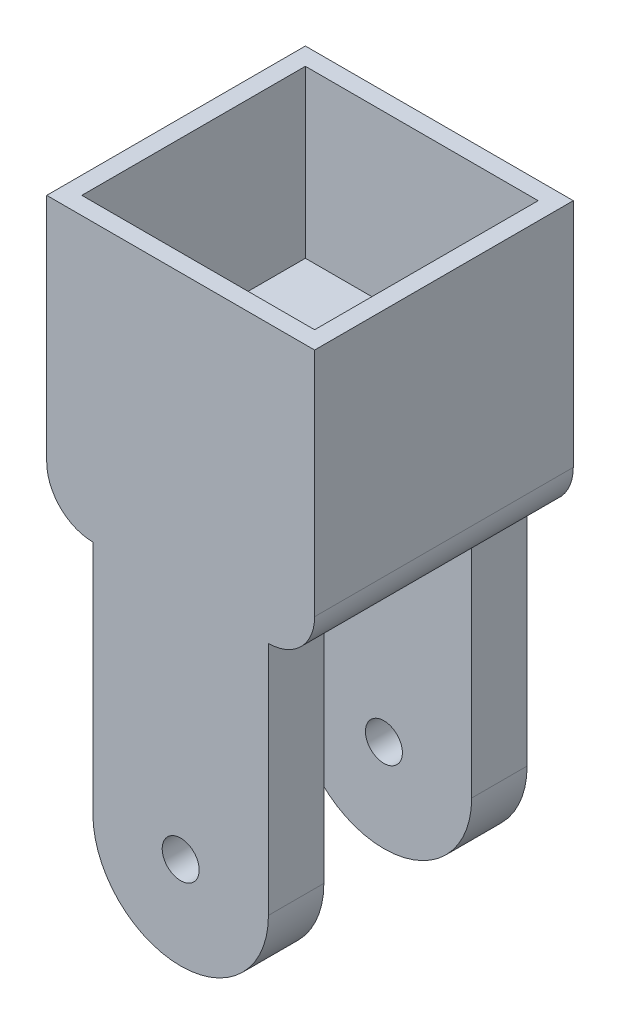
ISO-10303-21;
HEADER;
FILE_DESCRIPTION(('STEP AP214'),'2;1');
FILE_NAME('part.step','',(''),(''),'','','');
FILE_SCHEMA(('AUTOMOTIVE_DESIGN { 1 0 10303 214 1 1 1 1 }'));
ENDSEC;
DATA;
#1=APPLICATION_CONTEXT('core data for automotive mechanical design processes');
#2=APPLICATION_PROTOCOL_DEFINITION('international standard','automotive_design',2000,#1);
#3=PRODUCT_CONTEXT('',#1,'mechanical');
#4=PRODUCT('Part','Part','',(#3));
#5=PRODUCT_RELATED_PRODUCT_CATEGORY('part','',(#4));
#6=PRODUCT_DEFINITION_FORMATION('','',#4);
#7=PRODUCT_DEFINITION_CONTEXT('part definition',#1,'design');
#8=PRODUCT_DEFINITION('design','',#6,#7);
#9=PRODUCT_DEFINITION_SHAPE('','',#8);
#10=(LENGTH_UNIT() NAMED_UNIT(*) SI_UNIT(.MILLI.,.METRE.));
#11=(NAMED_UNIT(*) PLANE_ANGLE_UNIT() SI_UNIT($,.RADIAN.));
#12=(NAMED_UNIT(*) SI_UNIT($,.STERADIAN.) SOLID_ANGLE_UNIT());
#13=UNCERTAINTY_MEASURE_WITH_UNIT(LENGTH_MEASURE(1.E-05),#10,'distance_accuracy_value','');
#14=(GEOMETRIC_REPRESENTATION_CONTEXT(3) GLOBAL_UNCERTAINTY_ASSIGNED_CONTEXT((#13)) GLOBAL_UNIT_ASSIGNED_CONTEXT((#10,
#11,#12)) REPRESENTATION_CONTEXT('',''));
#15=CARTESIAN_POINT('',(0.,0.,0.));
#16=DIRECTION('',(0.,0.,1.));
#17=DIRECTION('',(1.,0.,0.));
#18=AXIS2_PLACEMENT_3D('',#15,#16,#17);
#19=CARTESIAN_POINT('',(0.,30.,0.));
#20=DIRECTION('',(0.,1.,0.));
#21=DIRECTION('',(0.,0.,-1.));
#22=AXIS2_PLACEMENT_3D('',#19,#20,#21);
#23=PLANE('',#22);
#24=DIRECTION('',(1.,0.,0.));
#25=VECTOR('',#24,1.);
#26=CARTESIAN_POINT('',(-14.5,30.,14.));
#27=LINE('',#26,#25);
#28=CARTESIAN_POINT('',(-14.5,30.,14.));
#29=VERTEX_POINT('',#28);
#30=CARTESIAN_POINT('',(14.5,30.,14.));
#31=VERTEX_POINT('',#30);
#32=EDGE_CURVE('E250',#29,#31,#27,.T.);
#33=ORIENTED_EDGE('',*,*,#32,.T.);
#34=DIRECTION('',(0.,0.,1.));
#35=VECTOR('',#34,1.);
#36=CARTESIAN_POINT('',(14.5,30.,-14.));
#37=LINE('',#36,#35);
#38=CARTESIAN_POINT('',(14.5,30.,-14.));
#39=VERTEX_POINT('',#38);
#40=EDGE_CURVE('E253',#39,#31,#37,.T.);
#41=ORIENTED_EDGE('',*,*,#40,.F.);
#42=DIRECTION('',(1.,0.,0.));
#43=VECTOR('',#42,1.);
#44=CARTESIAN_POINT('',(-14.5,30.,-14.));
#45=LINE('',#44,#43);
#46=CARTESIAN_POINT('',(-14.5,30.,-14.));
#47=VERTEX_POINT('',#46);
#48=EDGE_CURVE('E256',#47,#39,#45,.T.);
#49=ORIENTED_EDGE('',*,*,#48,.F.);
#50=DIRECTION('',(0.,0.,1.));
#51=VECTOR('',#50,1.);
#52=CARTESIAN_POINT('',(-14.5,30.,-14.));
#53=LINE('',#52,#51);
#54=EDGE_CURVE('E259',#47,#29,#53,.T.);
#55=ORIENTED_EDGE('',*,*,#54,.T.);
#56=EDGE_LOOP('',(#33,#41,#49,#55));
#57=FACE_BOUND('',#56,.T.);
#58=DIRECTION('',(0.,0.,1.));
#59=VECTOR('',#58,1.);
#60=CARTESIAN_POINT('',(12.6,30.,-12.1));
#61=LINE('',#60,#59);
#62=CARTESIAN_POINT('',(12.6,30.,-12.1));
#63=VERTEX_POINT('',#62);
#64=CARTESIAN_POINT('',(12.6,30.,12.1));
#65=VERTEX_POINT('',#64);
#66=EDGE_CURVE('E191',#63,#65,#61,.T.);
#67=ORIENTED_EDGE('',*,*,#66,.T.);
#68=DIRECTION('',(-1.,0.,0.));
#69=VECTOR('',#68,1.);
#70=CARTESIAN_POINT('',(12.6,30.,12.1));
#71=LINE('',#70,#69);
#72=CARTESIAN_POINT('',(-12.6,30.,12.1));
#73=VERTEX_POINT('',#72);
#74=EDGE_CURVE('E189',#65,#73,#71,.T.);
#75=ORIENTED_EDGE('',*,*,#74,.T.);
#76=DIRECTION('',(0.,0.,1.));
#77=VECTOR('',#76,1.);
#78=CARTESIAN_POINT('',(-12.6,30.,-12.1));
#79=LINE('',#78,#77);
#80=CARTESIAN_POINT('',(-12.6,30.,-12.1));
#81=VERTEX_POINT('',#80);
#82=EDGE_CURVE('E168',#81,#73,#79,.T.);
#83=ORIENTED_EDGE('',*,*,#82,.F.);
#84=DIRECTION('',(-1.,0.,0.));
#85=VECTOR('',#84,1.);
#86=CARTESIAN_POINT('',(12.6,30.,-12.1));
#87=LINE('',#86,#85);
#88=EDGE_CURVE('E179',#63,#81,#87,.T.);
#89=ORIENTED_EDGE('',*,*,#88,.F.);
#90=EDGE_LOOP('',(#67,#75,#83,#89));
#91=FACE_BOUND('',#90,.T.);
#92=ADVANCED_FACE('F39',(#57,#91),#23,.T.);
#93=CARTESIAN_POINT('',(0.,0.,0.));
#94=DIRECTION('',(0.,1.,0.));
#95=DIRECTION('',(0.,0.,-1.));
#96=AXIS2_PLACEMENT_3D('',#93,#94,#95);
#97=PLANE('',#96);
#98=DIRECTION('',(1.,0.,0.));
#99=VECTOR('',#98,1.);
#100=CARTESIAN_POINT('',(-9.5,0.,-8.));
#101=LINE('',#100,#99);
#102=CARTESIAN_POINT('',(-9.5,0.,-8.));
#103=VERTEX_POINT('',#102);
#104=CARTESIAN_POINT('',(9.5,0.,-8.));
#105=VERTEX_POINT('',#104);
#106=EDGE_CURVE('E215',#103,#105,#101,.T.);
#107=ORIENTED_EDGE('',*,*,#106,.T.);
#108=DIRECTION('',(0.,0.,1.));
#109=VECTOR('',#108,1.);
#110=CARTESIAN_POINT('',(9.5,0.,0.));
#111=LINE('',#110,#109);
#112=CARTESIAN_POINT('',(9.5,0.,8.));
#113=VERTEX_POINT('',#112);
#114=EDGE_CURVE('E266',#113,#105,#111,.F.);
#115=ORIENTED_EDGE('',*,*,#114,.F.);
#116=DIRECTION('',(-1.,0.,0.));
#117=VECTOR('',#116,1.);
#118=CARTESIAN_POINT('',(-9.5,0.,8.));
#119=LINE('',#118,#117);
#120=CARTESIAN_POINT('',(-9.5,0.,8.));
#121=VERTEX_POINT('',#120);
#122=EDGE_CURVE('E236',#113,#121,#119,.T.);
#123=ORIENTED_EDGE('',*,*,#122,.T.);
#124=DIRECTION('',(0.,0.,1.));
#125=VECTOR('',#124,1.);
#126=CARTESIAN_POINT('',(-9.50000000000001,0.,14.));
#127=LINE('',#126,#125);
#128=EDGE_CURVE('E279',#103,#121,#127,.T.);
#129=ORIENTED_EDGE('',*,*,#128,.F.);
#130=EDGE_LOOP('',(#107,#115,#123,#129));
#131=FACE_BOUND('',#130,.T.);
#132=ADVANCED_FACE('F351',(#131),#97,.F.);
#133=CARTESIAN_POINT('',(-14.5,30.,14.));
#134=DIRECTION('',(0.,0.,1.));
#135=DIRECTION('',(-1.,0.,0.));
#136=AXIS2_PLACEMENT_3D('',#133,#134,#135);
#137=PLANE('',#136);
#138=CARTESIAN_POINT('',(0.,-25.,14.));
#139=DIRECTION('',(0.,0.,-1.));
#140=DIRECTION('',(-1.,0.,0.));
#141=AXIS2_PLACEMENT_3D('',#138,#139,#140);
#142=CIRCLE('',#141,2.);
#143=CARTESIAN_POINT('',(-2.,-25.,14.));
#144=VERTEX_POINT('',#143);
#145=EDGE_CURVE('E202',#144,#144,#142,.T.);
#146=ORIENTED_EDGE('',*,*,#145,.T.);
#147=EDGE_LOOP('',(#146));
#148=FACE_BOUND('',#147,.T.);
#149=DIRECTION('',(0.,1.,0.));
#150=VECTOR('',#149,1.);
#151=CARTESIAN_POINT('',(9.5,-35.,14.));
#152=LINE('',#151,#150);
#153=CARTESIAN_POINT('',(9.5,-25.5,14.));
#154=VERTEX_POINT('',#153);
#155=CARTESIAN_POINT('',(9.49999999999999,0.,14.));
#156=VERTEX_POINT('',#155);
#157=EDGE_CURVE('E244',#154,#156,#152,.T.);
#158=ORIENTED_EDGE('',*,*,#157,.T.);
#159=CARTESIAN_POINT('',(9.5,5.,14.));
#160=DIRECTION('',(0.,0.,-1.));
#161=DIRECTION('',(-1.,0.,0.));
#162=AXIS2_PLACEMENT_3D('',#159,#160,#161);
#163=CIRCLE('',#162,5.);
#164=CARTESIAN_POINT('',(14.5,5.,14.));
#165=VERTEX_POINT('',#164);
#166=EDGE_CURVE('E282',#165,#156,#163,.T.);
#167=ORIENTED_EDGE('',*,*,#166,.F.);
#168=DIRECTION('',(0.,-1.,0.));
#169=VECTOR('',#168,1.);
#170=CARTESIAN_POINT('',(14.5,30.,14.));
#171=LINE('',#170,#169);
#172=EDGE_CURVE('E262',#31,#165,#171,.T.);
#173=ORIENTED_EDGE('',*,*,#172,.F.);
#174=ORIENTED_EDGE('',*,*,#32,.F.);
#175=DIRECTION('',(0.,-1.,0.));
#176=VECTOR('',#175,1.);
#177=CARTESIAN_POINT('',(-14.5,30.,14.));
#178=LINE('',#177,#176);
#179=CARTESIAN_POINT('',(-14.5,5.,14.));
#180=VERTEX_POINT('',#179);
#181=EDGE_CURVE('E263',#29,#180,#178,.T.);
#182=ORIENTED_EDGE('',*,*,#181,.T.);
#183=CARTESIAN_POINT('',(-9.50000000000001,5.,14.));
#184=DIRECTION('',(0.,0.,-1.));
#185=DIRECTION('',(-1.,0.,0.));
#186=AXIS2_PLACEMENT_3D('',#183,#184,#185);
#187=CIRCLE('',#186,5.);
#188=CARTESIAN_POINT('',(-9.50000000000001,0.,14.));
#189=VERTEX_POINT('',#188);
#190=EDGE_CURVE('E285',#189,#180,#187,.T.);
#191=ORIENTED_EDGE('',*,*,#190,.F.);
#192=DIRECTION('',(0.,1.,0.));
#193=VECTOR('',#192,1.);
#194=CARTESIAN_POINT('',(-9.50000000000001,-35.,14.));
#195=LINE('',#194,#193);
#196=CARTESIAN_POINT('',(-9.50000000000001,-25.5,14.));
#197=VERTEX_POINT('',#196);
#198=EDGE_CURVE('E247',#197,#189,#195,.T.);
#199=ORIENTED_EDGE('',*,*,#198,.F.);
#200=CARTESIAN_POINT('',(0.,-25.5,14.));
#201=DIRECTION('',(0.,0.,-1.));
#202=DIRECTION('',(-1.,0.,0.));
#203=AXIS2_PLACEMENT_3D('',#200,#201,#202);
#204=CIRCLE('',#203,9.5);
#205=CARTESIAN_POINT('',(0.,-35.,14.));
#206=VERTEX_POINT('',#205);
#207=EDGE_CURVE('E306',#206,#197,#204,.T.);
#208=ORIENTED_EDGE('',*,*,#207,.F.);
#209=CARTESIAN_POINT('',(0.,-25.5,14.));
#210=DIRECTION('',(0.,0.,-1.));
#211=DIRECTION('',(-1.,0.,0.));
#212=AXIS2_PLACEMENT_3D('',#209,#210,#211);
#213=CIRCLE('',#212,9.5);
#214=EDGE_CURVE('E309',#154,#206,#213,.T.);
#215=ORIENTED_EDGE('',*,*,#214,.F.);
#216=EDGE_LOOP('',(#158,#167,#173,#174,#182,#191,#199,#208,#215));
#217=FACE_BOUND('',#216,.T.);
#218=ADVANCED_FACE('F357',(#148,#217),#137,.T.);
#219=CARTESIAN_POINT('',(-14.5,30.,-14.));
#220=DIRECTION('',(-1.,0.,0.));
#221=DIRECTION('',(0.,0.,-1.));
#222=AXIS2_PLACEMENT_3D('',#219,#220,#221);
#223=PLANE('',#222);
#224=ORIENTED_EDGE('',*,*,#181,.F.);
#225=ORIENTED_EDGE('',*,*,#54,.F.);
#226=DIRECTION('',(0.,-1.,0.));
#227=VECTOR('',#226,1.);
#228=CARTESIAN_POINT('',(-14.5,30.,-14.));
#229=LINE('',#228,#227);
#230=CARTESIAN_POINT('',(-14.5,5.,-14.));
#231=VERTEX_POINT('',#230);
#232=EDGE_CURVE('E267',#47,#231,#229,.T.);
#233=ORIENTED_EDGE('',*,*,#232,.T.);
#234=DIRECTION('',(0.,0.,1.));
#235=VECTOR('',#234,1.);
#236=CARTESIAN_POINT('',(-14.5,5.,-14.));
#237=LINE('',#236,#235);
#238=EDGE_CURVE('E288',#180,#231,#237,.F.);
#239=ORIENTED_EDGE('',*,*,#238,.F.);
#240=EDGE_LOOP('',(#224,#225,#233,#239));
#241=FACE_BOUND('',#240,.T.);
#242=ADVANCED_FACE('F364',(#241),#223,.T.);
#243=CARTESIAN_POINT('',(-14.5,30.,-14.));
#244=DIRECTION('',(0.,0.,1.));
#245=DIRECTION('',(-1.,0.,0.));
#246=AXIS2_PLACEMENT_3D('',#243,#244,#245);
#247=PLANE('',#246);
#248=CARTESIAN_POINT('',(0.,-25.,-14.));
#249=DIRECTION('',(0.,0.,-1.));
#250=DIRECTION('',(-1.,0.,0.));
#251=AXIS2_PLACEMENT_3D('',#248,#249,#250);
#252=CIRCLE('',#251,2.);
#253=CARTESIAN_POINT('',(-2.,-25.,-14.));
#254=VERTEX_POINT('',#253);
#255=EDGE_CURVE('E204',#254,#254,#252,.T.);
#256=ORIENTED_EDGE('',*,*,#255,.F.);
#257=EDGE_LOOP('',(#256));
#258=FACE_BOUND('',#257,.T.);
#259=CARTESIAN_POINT('',(0.,-25.5,-14.));
#260=DIRECTION('',(0.,0.,-1.));
#261=DIRECTION('',(-1.,0.,0.));
#262=AXIS2_PLACEMENT_3D('',#259,#260,#261);
#263=CIRCLE('',#262,9.5);
#264=CARTESIAN_POINT('',(-9.50000000000001,-25.5,-14.));
#265=VERTEX_POINT('',#264);
#266=CARTESIAN_POINT('',(0.,-35.,-14.));
#267=VERTEX_POINT('',#266);
#268=EDGE_CURVE('E315',#265,#267,#263,.F.);
#269=ORIENTED_EDGE('',*,*,#268,.F.);
#270=DIRECTION('',(0.,1.,0.));
#271=VECTOR('',#270,1.);
#272=CARTESIAN_POINT('',(-9.50000000000001,-35.,-14.));
#273=LINE('',#272,#271);
#274=CARTESIAN_POINT('',(-9.50000000000001,0.,-14.));
#275=VERTEX_POINT('',#274);
#276=EDGE_CURVE('E220',#265,#275,#273,.T.);
#277=ORIENTED_EDGE('',*,*,#276,.T.);
#278=CARTESIAN_POINT('',(-9.50000000000001,5.,-14.));
#279=DIRECTION('',(0.,0.,-1.));
#280=DIRECTION('',(-1.,0.,0.));
#281=AXIS2_PLACEMENT_3D('',#278,#279,#280);
#282=CIRCLE('',#281,5.);
#283=EDGE_CURVE('E294',#231,#275,#282,.F.);
#284=ORIENTED_EDGE('',*,*,#283,.F.);
#285=ORIENTED_EDGE('',*,*,#232,.F.);
#286=ORIENTED_EDGE('',*,*,#48,.T.);
#287=DIRECTION('',(0.,-1.,0.));
#288=VECTOR('',#287,1.);
#289=CARTESIAN_POINT('',(14.5,30.,-14.));
#290=LINE('',#289,#288);
#291=CARTESIAN_POINT('',(14.5,5.,-14.));
#292=VERTEX_POINT('',#291);
#293=EDGE_CURVE('E270',#39,#292,#290,.T.);
#294=ORIENTED_EDGE('',*,*,#293,.T.);
#295=CARTESIAN_POINT('',(9.5,5.,-14.));
#296=DIRECTION('',(0.,0.,-1.));
#297=DIRECTION('',(-1.,0.,0.));
#298=AXIS2_PLACEMENT_3D('',#295,#296,#297);
#299=CIRCLE('',#298,5.);
#300=CARTESIAN_POINT('',(9.49999999999999,0.,-14.));
#301=VERTEX_POINT('',#300);
#302=EDGE_CURVE('E291',#301,#292,#299,.F.);
#303=ORIENTED_EDGE('',*,*,#302,.F.);
#304=DIRECTION('',(0.,1.,0.));
#305=VECTOR('',#304,1.);
#306=CARTESIAN_POINT('',(9.5,-35.,-14.));
#307=LINE('',#306,#305);
#308=CARTESIAN_POINT('',(9.5,-25.5,-14.));
#309=VERTEX_POINT('',#308);
#310=EDGE_CURVE('E223',#309,#301,#307,.T.);
#311=ORIENTED_EDGE('',*,*,#310,.F.);
#312=CARTESIAN_POINT('',(0.,-25.5,-14.));
#313=DIRECTION('',(0.,0.,-1.));
#314=DIRECTION('',(-1.,0.,0.));
#315=AXIS2_PLACEMENT_3D('',#312,#313,#314);
#316=CIRCLE('',#315,9.5);
#317=EDGE_CURVE('E317',#267,#309,#316,.F.);
#318=ORIENTED_EDGE('',*,*,#317,.F.);
#319=EDGE_LOOP('',(#269,#277,#284,#285,#286,#294,#303,#311,#318));
#320=FACE_BOUND('',#319,.T.);
#321=ADVANCED_FACE('F367',(#258,#320),#247,.F.);
#322=CARTESIAN_POINT('',(14.5,30.,-14.));
#323=DIRECTION('',(-1.,0.,0.));
#324=DIRECTION('',(0.,0.,-1.));
#325=AXIS2_PLACEMENT_3D('',#322,#323,#324);
#326=PLANE('',#325);
#327=ORIENTED_EDGE('',*,*,#293,.F.);
#328=ORIENTED_EDGE('',*,*,#40,.T.);
#329=ORIENTED_EDGE('',*,*,#172,.T.);
#330=DIRECTION('',(0.,0.,1.));
#331=VECTOR('',#330,1.);
#332=CARTESIAN_POINT('',(14.5,5.,-14.));
#333=LINE('',#332,#331);
#334=EDGE_CURVE('E297',#292,#165,#333,.T.);
#335=ORIENTED_EDGE('',*,*,#334,.F.);
#336=EDGE_LOOP('',(#327,#328,#329,#335));
#337=FACE_BOUND('',#336,.T.);
#338=ADVANCED_FACE('F371',(#337),#326,.F.);
#339=CARTESIAN_POINT('',(-9.50000000000001,-35.,14.));
#340=DIRECTION('',(1.,0.,0.));
#341=DIRECTION('',(0.,0.,1.));
#342=AXIS2_PLACEMENT_3D('',#339,#340,#341);
#343=PLANE('',#342);
#344=ORIENTED_EDGE('',*,*,#198,.T.);
#345=DIRECTION('',(0.,0.,1.));
#346=VECTOR('',#345,1.);
#347=CARTESIAN_POINT('',(-9.50000000000001,0.,14.));
#348=LINE('',#347,#346);
#349=EDGE_CURVE('E232',#121,#189,#348,.T.);
#350=ORIENTED_EDGE('',*,*,#349,.F.);
#351=DIRECTION('',(0.,1.,0.));
#352=VECTOR('',#351,1.);
#353=CARTESIAN_POINT('',(-9.5,-35.,8.));
#354=LINE('',#353,#352);
#355=CARTESIAN_POINT('',(-9.5,-25.5,8.));
#356=VERTEX_POINT('',#355);
#357=EDGE_CURVE('E239',#356,#121,#354,.T.);
#358=ORIENTED_EDGE('',*,*,#357,.F.);
#359=DIRECTION('',(0.,0.,1.));
#360=VECTOR('',#359,1.);
#361=CARTESIAN_POINT('',(-9.50000000000001,-25.5,14.));
#362=LINE('',#361,#360);
#363=EDGE_CURVE('E312',#197,#356,#362,.F.);
#364=ORIENTED_EDGE('',*,*,#363,.F.);
#365=EDGE_LOOP('',(#344,#350,#358,#364));
#366=FACE_BOUND('',#365,.T.);
#367=ADVANCED_FACE('F361',(#366),#343,.F.);
#368=CARTESIAN_POINT('',(9.5,-35.,14.));
#369=DIRECTION('',(-1.,0.,0.));
#370=DIRECTION('',(0.,0.,-1.));
#371=AXIS2_PLACEMENT_3D('',#368,#369,#370);
#372=PLANE('',#371);
#373=DIRECTION('',(0.,1.,0.));
#374=VECTOR('',#373,1.);
#375=CARTESIAN_POINT('',(9.5,-35.,8.));
#376=LINE('',#375,#374);
#377=CARTESIAN_POINT('',(9.5,-25.5,8.));
#378=VERTEX_POINT('',#377);
#379=EDGE_CURVE('E241',#378,#113,#376,.T.);
#380=ORIENTED_EDGE('',*,*,#379,.T.);
#381=DIRECTION('',(0.,0.,-1.));
#382=VECTOR('',#381,1.);
#383=CARTESIAN_POINT('',(9.5,0.,14.));
#384=LINE('',#383,#382);
#385=EDGE_CURVE('E234',#156,#113,#384,.T.);
#386=ORIENTED_EDGE('',*,*,#385,.F.);
#387=ORIENTED_EDGE('',*,*,#157,.F.);
#388=DIRECTION('',(0.,0.,-1.));
#389=VECTOR('',#388,1.);
#390=CARTESIAN_POINT('',(9.5,-25.5,14.));
#391=LINE('',#390,#389);
#392=EDGE_CURVE('E304',#378,#154,#391,.F.);
#393=ORIENTED_EDGE('',*,*,#392,.F.);
#394=EDGE_LOOP('',(#380,#386,#387,#393));
#395=FACE_BOUND('',#394,.T.);
#396=ADVANCED_FACE('F425',(#395),#372,.F.);
#397=CARTESIAN_POINT('',(-9.5,-35.,8.));
#398=DIRECTION('',(0.,0.,1.));
#399=DIRECTION('',(-1.,0.,0.));
#400=AXIS2_PLACEMENT_3D('',#397,#398,#399);
#401=PLANE('',#400);
#402=CARTESIAN_POINT('',(0.,-25.,8.00000000000001));
#403=DIRECTION('',(0.,0.,-1.));
#404=DIRECTION('',(-1.,0.,0.));
#405=AXIS2_PLACEMENT_3D('',#402,#403,#404);
#406=CIRCLE('',#405,2.);
#407=CARTESIAN_POINT('',(-2.,-25.,8.00000000000001));
#408=VERTEX_POINT('',#407);
#409=EDGE_CURVE('E210',#408,#408,#406,.T.);
#410=ORIENTED_EDGE('',*,*,#409,.F.);
#411=EDGE_LOOP('',(#410));
#412=FACE_BOUND('',#411,.T.);
#413=CARTESIAN_POINT('',(0.,-25.5,8.));
#414=DIRECTION('',(0.,0.,-1.));
#415=DIRECTION('',(-1.,0.,0.));
#416=AXIS2_PLACEMENT_3D('',#413,#414,#415);
#417=CIRCLE('',#416,9.5);
#418=CARTESIAN_POINT('',(0.,-35.,8.));
#419=VERTEX_POINT('',#418);
#420=EDGE_CURVE('E299',#356,#419,#417,.F.);
#421=ORIENTED_EDGE('',*,*,#420,.F.);
#422=ORIENTED_EDGE('',*,*,#357,.T.);
#423=ORIENTED_EDGE('',*,*,#122,.F.);
#424=ORIENTED_EDGE('',*,*,#379,.F.);
#425=CARTESIAN_POINT('',(0.,-25.5,8.));
#426=DIRECTION('',(0.,0.,-1.));
#427=DIRECTION('',(-1.,0.,0.));
#428=AXIS2_PLACEMENT_3D('',#425,#426,#427);
#429=CIRCLE('',#428,9.5);
#430=EDGE_CURVE('E302',#419,#378,#429,.F.);
#431=ORIENTED_EDGE('',*,*,#430,.F.);
#432=EDGE_LOOP('',(#421,#422,#423,#424,#431));
#433=FACE_BOUND('',#432,.T.);
#434=ADVANCED_FACE('F428',(#412,#433),#401,.F.);
#435=CARTESIAN_POINT('',(-9.50000000000001,-35.,-14.));
#436=DIRECTION('',(1.,0.,0.));
#437=DIRECTION('',(0.,0.,1.));
#438=AXIS2_PLACEMENT_3D('',#435,#436,#437);
#439=PLANE('',#438);
#440=DIRECTION('',(0.,1.,0.));
#441=VECTOR('',#440,1.);
#442=CARTESIAN_POINT('',(-9.5,-35.,-8.));
#443=LINE('',#442,#441);
#444=CARTESIAN_POINT('',(-9.5,-25.5,-8.));
#445=VERTEX_POINT('',#444);
#446=EDGE_CURVE('E229',#445,#103,#443,.T.);
#447=ORIENTED_EDGE('',*,*,#446,.T.);
#448=DIRECTION('',(0.,0.,1.));
#449=VECTOR('',#448,1.);
#450=CARTESIAN_POINT('',(-9.50000000000001,0.,-14.));
#451=LINE('',#450,#449);
#452=EDGE_CURVE('E213',#275,#103,#451,.T.);
#453=ORIENTED_EDGE('',*,*,#452,.F.);
#454=ORIENTED_EDGE('',*,*,#276,.F.);
#455=DIRECTION('',(0.,0.,1.));
#456=VECTOR('',#455,1.);
#457=CARTESIAN_POINT('',(-9.50000000000001,-25.5,-14.));
#458=LINE('',#457,#456);
#459=EDGE_CURVE('E12',#445,#265,#458,.F.);
#460=ORIENTED_EDGE('',*,*,#459,.F.);
#461=EDGE_LOOP('',(#447,#453,#454,#460));
#462=FACE_BOUND('',#461,.T.);
#463=ADVANCED_FACE('F409',(#462),#439,.F.);
#464=CARTESIAN_POINT('',(-9.5,-35.,-8.));
#465=DIRECTION('',(0.,0.,-1.));
#466=DIRECTION('',(1.,0.,0.));
#467=AXIS2_PLACEMENT_3D('',#464,#465,#466);
#468=PLANE('',#467);
#469=CARTESIAN_POINT('',(0.,-25.,-8.));
#470=DIRECTION('',(0.,0.,1.));
#471=DIRECTION('',(1.,0.,0.));
#472=AXIS2_PLACEMENT_3D('',#469,#470,#471);
#473=CIRCLE('',#472,2.);
#474=CARTESIAN_POINT('',(2.,-25.,-8.));
#475=VERTEX_POINT('',#474);
#476=EDGE_CURVE('E207',#475,#475,#473,.T.);
#477=ORIENTED_EDGE('',*,*,#476,.F.);
#478=EDGE_LOOP('',(#477));
#479=FACE_BOUND('',#478,.T.);
#480=DIRECTION('',(0.,1.,0.));
#481=VECTOR('',#480,1.);
#482=CARTESIAN_POINT('',(9.5,-35.,-8.));
#483=LINE('',#482,#481);
#484=CARTESIAN_POINT('',(9.5,-25.5,-8.));
#485=VERTEX_POINT('',#484);
#486=EDGE_CURVE('E226',#485,#105,#483,.T.);
#487=ORIENTED_EDGE('',*,*,#486,.T.);
#488=ORIENTED_EDGE('',*,*,#106,.F.);
#489=ORIENTED_EDGE('',*,*,#446,.F.);
#490=CARTESIAN_POINT('',(0.,-25.5,-8.));
#491=DIRECTION('',(0.,0.,1.));
#492=DIRECTION('',(1.,0.,0.));
#493=AXIS2_PLACEMENT_3D('',#490,#491,#492);
#494=CIRCLE('',#493,9.5);
#495=CARTESIAN_POINT('',(0.,-35.,-8.));
#496=VERTEX_POINT('',#495);
#497=EDGE_CURVE('E55',#496,#445,#494,.F.);
#498=ORIENTED_EDGE('',*,*,#497,.F.);
#499=CARTESIAN_POINT('',(0.,-25.5,-8.));
#500=DIRECTION('',(0.,0.,1.));
#501=DIRECTION('',(1.,0.,0.));
#502=AXIS2_PLACEMENT_3D('',#499,#500,#501);
#503=CIRCLE('',#502,9.5);
#504=EDGE_CURVE('E48',#485,#496,#503,.F.);
#505=ORIENTED_EDGE('',*,*,#504,.F.);
#506=EDGE_LOOP('',(#487,#488,#489,#498,#505));
#507=FACE_BOUND('',#506,.T.);
#508=ADVANCED_FACE('F405',(#479,#507),#468,.F.);
#509=CARTESIAN_POINT('',(9.5,-35.,-14.));
#510=DIRECTION('',(-1.,0.,0.));
#511=DIRECTION('',(0.,0.,-1.));
#512=AXIS2_PLACEMENT_3D('',#509,#510,#511);
#513=PLANE('',#512);
#514=ORIENTED_EDGE('',*,*,#310,.T.);
#515=DIRECTION('',(0.,0.,-1.));
#516=VECTOR('',#515,1.);
#517=CARTESIAN_POINT('',(9.5,0.,-14.));
#518=LINE('',#517,#516);
#519=EDGE_CURVE('E218',#105,#301,#518,.T.);
#520=ORIENTED_EDGE('',*,*,#519,.F.);
#521=ORIENTED_EDGE('',*,*,#486,.F.);
#522=DIRECTION('',(0.,0.,-1.));
#523=VECTOR('',#522,1.);
#524=CARTESIAN_POINT('',(9.5,-25.5,-8.));
#525=LINE('',#524,#523);
#526=EDGE_CURVE('E320',#309,#485,#525,.F.);
#527=ORIENTED_EDGE('',*,*,#526,.F.);
#528=EDGE_LOOP('',(#514,#520,#521,#527));
#529=FACE_BOUND('',#528,.T.);
#530=ADVANCED_FACE('F419',(#529),#513,.F.);
#531=CARTESIAN_POINT('',(0.,-25.,-14.));
#532=DIRECTION('',(0.,0.,1.));
#533=DIRECTION('',(-1.,0.,0.));
#534=AXIS2_PLACEMENT_3D('',#531,#532,#533);
#535=CYLINDRICAL_SURFACE('',#534,2.);
#536=ORIENTED_EDGE('',*,*,#255,.T.);
#537=EDGE_LOOP('',(#536));
#538=FACE_BOUND('',#537,.T.);
#539=ORIENTED_EDGE('',*,*,#476,.T.);
#540=EDGE_LOOP('',(#539));
#541=FACE_BOUND('',#540,.T.);
#542=ADVANCED_FACE('F457',(#538,#541),#535,.F.);
#543=ORIENTED_EDGE('',*,*,#145,.F.);
#544=EDGE_LOOP('',(#543));
#545=FACE_BOUND('',#544,.T.);
#546=ORIENTED_EDGE('',*,*,#409,.T.);
#547=EDGE_LOOP('',(#546));
#548=FACE_BOUND('',#547,.T.);
#549=ADVANCED_FACE('F458',(#545,#548),#535,.F.);
#550=CARTESIAN_POINT('',(12.6,-34.9382312088062,-12.1));
#551=DIRECTION('',(0.,0.,1.));
#552=DIRECTION('',(-1.,0.,0.));
#553=AXIS2_PLACEMENT_3D('',#550,#551,#552);
#554=PLANE('',#553);
#555=DIRECTION('',(0.,1.,0.));
#556=VECTOR('',#555,1.);
#557=CARTESIAN_POINT('',(-12.6,-34.9382312088062,-12.1));
#558=LINE('',#557,#556);
#559=CARTESIAN_POINT('',(-12.6,12.,-12.1));
#560=VERTEX_POINT('',#559);
#561=EDGE_CURVE('E163',#560,#81,#558,.T.);
#562=ORIENTED_EDGE('',*,*,#561,.F.);
#563=DIRECTION('',(1.,0.,0.));
#564=VECTOR('',#563,1.);
#565=CARTESIAN_POINT('',(12.6,12.,-12.1));
#566=LINE('',#565,#564);
#567=CARTESIAN_POINT('',(12.6,12.,-12.1));
#568=VERTEX_POINT('',#567);
#569=EDGE_CURVE('E203',#560,#568,#566,.T.);
#570=ORIENTED_EDGE('',*,*,#569,.T.);
#571=DIRECTION('',(0.,1.,0.));
#572=VECTOR('',#571,1.);
#573=CARTESIAN_POINT('',(12.6,-34.9382312088062,-12.1));
#574=LINE('',#573,#572);
#575=EDGE_CURVE('E182',#568,#63,#574,.T.);
#576=ORIENTED_EDGE('',*,*,#575,.T.);
#577=ORIENTED_EDGE('',*,*,#88,.T.);
#578=EDGE_LOOP('',(#562,#570,#576,#577));
#579=FACE_BOUND('',#578,.T.);
#580=ADVANCED_FACE('F180',(#579),#554,.T.);
#581=CARTESIAN_POINT('',(-12.6,-34.9382312088062,-12.1));
#582=DIRECTION('',(1.,0.,0.));
#583=DIRECTION('',(0.,0.,1.));
#584=AXIS2_PLACEMENT_3D('',#581,#582,#583);
#585=PLANE('',#584);
#586=DIRECTION('',(0.,1.,0.));
#587=VECTOR('',#586,1.);
#588=CARTESIAN_POINT('',(-12.6,-34.9382312088062,12.1));
#589=LINE('',#588,#587);
#590=CARTESIAN_POINT('',(-12.6,12.,12.1));
#591=VERTEX_POINT('',#590);
#592=EDGE_CURVE('E176',#591,#73,#589,.T.);
#593=ORIENTED_EDGE('',*,*,#592,.F.);
#594=DIRECTION('',(0.,0.,-1.));
#595=VECTOR('',#594,1.);
#596=CARTESIAN_POINT('',(-12.6,12.,-12.1));
#597=LINE('',#596,#595);
#598=EDGE_CURVE('E171',#591,#560,#597,.T.);
#599=ORIENTED_EDGE('',*,*,#598,.T.);
#600=ORIENTED_EDGE('',*,*,#561,.T.);
#601=ORIENTED_EDGE('',*,*,#82,.T.);
#602=EDGE_LOOP('',(#593,#599,#600,#601));
#603=FACE_BOUND('',#602,.T.);
#604=ADVANCED_FACE('F166',(#603),#585,.T.);
#605=CARTESIAN_POINT('',(12.6,-34.9382312088062,12.1));
#606=DIRECTION('',(0.,0.,1.));
#607=DIRECTION('',(-1.,0.,0.));
#608=AXIS2_PLACEMENT_3D('',#605,#606,#607);
#609=PLANE('',#608);
#610=DIRECTION('',(1.,0.,0.));
#611=VECTOR('',#610,1.);
#612=CARTESIAN_POINT('',(12.6,12.,12.1));
#613=LINE('',#612,#611);
#614=CARTESIAN_POINT('',(12.6,12.,12.1));
#615=VERTEX_POINT('',#614);
#616=EDGE_CURVE('E175',#591,#615,#613,.T.);
#617=ORIENTED_EDGE('',*,*,#616,.F.);
#618=ORIENTED_EDGE('',*,*,#592,.T.);
#619=ORIENTED_EDGE('',*,*,#74,.F.);
#620=DIRECTION('',(0.,1.,0.));
#621=VECTOR('',#620,1.);
#622=CARTESIAN_POINT('',(12.6,-34.9382312088062,12.1));
#623=LINE('',#622,#621);
#624=EDGE_CURVE('E197',#615,#65,#623,.T.);
#625=ORIENTED_EDGE('',*,*,#624,.F.);
#626=EDGE_LOOP('',(#617,#618,#619,#625));
#627=FACE_BOUND('',#626,.T.);
#628=ADVANCED_FACE('F341',(#627),#609,.F.);
#629=CARTESIAN_POINT('',(12.6,-34.9382312088062,-12.1));
#630=DIRECTION('',(1.,0.,0.));
#631=DIRECTION('',(0.,0.,1.));
#632=AXIS2_PLACEMENT_3D('',#629,#630,#631);
#633=PLANE('',#632);
#634=DIRECTION('',(0.,0.,-1.));
#635=VECTOR('',#634,1.);
#636=CARTESIAN_POINT('',(12.6,12.,-12.1));
#637=LINE('',#636,#635);
#638=EDGE_CURVE('E200',#615,#568,#637,.T.);
#639=ORIENTED_EDGE('',*,*,#638,.F.);
#640=ORIENTED_EDGE('',*,*,#624,.T.);
#641=ORIENTED_EDGE('',*,*,#66,.F.);
#642=ORIENTED_EDGE('',*,*,#575,.F.);
#643=EDGE_LOOP('',(#639,#640,#641,#642));
#644=FACE_BOUND('',#643,.T.);
#645=ADVANCED_FACE('F339',(#644),#633,.F.);
#646=CARTESIAN_POINT('',(0.,12.,0.));
#647=DIRECTION('',(0.,1.,0.));
#648=DIRECTION('',(0.,0.,-1.));
#649=AXIS2_PLACEMENT_3D('',#646,#647,#648);
#650=PLANE('',#649);
#651=CARTESIAN_POINT('',(0.,12.,0.));
#652=DIRECTION('',(0.,-1.,0.));
#653=DIRECTION('',(0.,0.,-1.));
#654=AXIS2_PLACEMENT_3D('',#651,#652,#653);
#655=CIRCLE('',#654,5.1);
#656=CARTESIAN_POINT('',(0.,12.,-5.1));
#657=VERTEX_POINT('',#656);
#658=EDGE_CURVE('E324',#657,#657,#655,.T.);
#659=ORIENTED_EDGE('',*,*,#658,.T.);
#660=EDGE_LOOP('',(#659));
#661=FACE_BOUND('',#660,.T.);
#662=ORIENTED_EDGE('',*,*,#598,.F.);
#663=ORIENTED_EDGE('',*,*,#616,.T.);
#664=ORIENTED_EDGE('',*,*,#638,.T.);
#665=ORIENTED_EDGE('',*,*,#569,.F.);
#666=EDGE_LOOP('',(#662,#663,#664,#665));
#667=FACE_BOUND('',#666,.T.);
#668=ADVANCED_FACE('F336',(#661,#667),#650,.T.);
#669=CARTESIAN_POINT('',(0.,2.,0.));
#670=DIRECTION('',(0.,1.,0.));
#671=DIRECTION('',(0.,0.,-1.));
#672=AXIS2_PLACEMENT_3D('',#669,#670,#671);
#673=CYLINDRICAL_SURFACE('',#672,5.1);
#674=CARTESIAN_POINT('',(0.,2.,0.));
#675=DIRECTION('',(0.,-1.,0.));
#676=DIRECTION('',(0.,0.,-1.));
#677=AXIS2_PLACEMENT_3D('',#674,#675,#676);
#678=CIRCLE('',#677,5.1);
#679=CARTESIAN_POINT('',(0.,2.,-5.1));
#680=VERTEX_POINT('',#679);
#681=EDGE_CURVE('E186',#680,#680,#678,.T.);
#682=ORIENTED_EDGE('',*,*,#681,.T.);
#683=EDGE_LOOP('',(#682));
#684=FACE_BOUND('',#683,.T.);
#685=ORIENTED_EDGE('',*,*,#658,.F.);
#686=EDGE_LOOP('',(#685));
#687=FACE_BOUND('',#686,.T.);
#688=ADVANCED_FACE('F491',(#684,#687),#673,.F.);
#689=CARTESIAN_POINT('',(0.,2.,0.));
#690=DIRECTION('',(0.,1.,0.));
#691=DIRECTION('',(0.,0.,-1.));
#692=AXIS2_PLACEMENT_3D('',#689,#690,#691);
#693=PLANE('',#692);
#694=ORIENTED_EDGE('',*,*,#681,.F.);
#695=EDGE_LOOP('',(#694));
#696=FACE_BOUND('',#695,.T.);
#697=ADVANCED_FACE('F383',(#696),#693,.T.);
#698=CARTESIAN_POINT('',(-9.50000000000001,5.,0.));
#699=DIRECTION('',(0.,0.,-1.));
#700=DIRECTION('',(1.,0.,0.));
#701=AXIS2_PLACEMENT_3D('',#698,#699,#700);
#702=CYLINDRICAL_SURFACE('',#701,5.);
#703=ORIENTED_EDGE('',*,*,#283,.T.);
#704=ORIENTED_EDGE('',*,*,#452,.T.);
#705=ORIENTED_EDGE('',*,*,#128,.T.);
#706=ORIENTED_EDGE('',*,*,#349,.T.);
#707=ORIENTED_EDGE('',*,*,#190,.T.);
#708=ORIENTED_EDGE('',*,*,#238,.T.);
#709=EDGE_LOOP('',(#703,#704,#705,#706,#707,#708));
#710=FACE_BOUND('',#709,.T.);
#711=ADVANCED_FACE('F379',(#710),#702,.T.);
#712=CARTESIAN_POINT('',(9.5,5.,-14.));
#713=DIRECTION('',(0.,0.,1.));
#714=DIRECTION('',(-1.,0.,0.));
#715=AXIS2_PLACEMENT_3D('',#712,#713,#714);
#716=CYLINDRICAL_SURFACE('',#715,5.);
#717=ORIENTED_EDGE('',*,*,#114,.T.);
#718=ORIENTED_EDGE('',*,*,#519,.T.);
#719=ORIENTED_EDGE('',*,*,#302,.T.);
#720=ORIENTED_EDGE('',*,*,#334,.T.);
#721=ORIENTED_EDGE('',*,*,#166,.T.);
#722=ORIENTED_EDGE('',*,*,#385,.T.);
#723=EDGE_LOOP('',(#717,#718,#719,#720,#721,#722));
#724=FACE_BOUND('',#723,.T.);
#725=ADVANCED_FACE('F382',(#724),#716,.T.);
#726=CARTESIAN_POINT('',(0.,-25.5,0.));
#727=DIRECTION('',(0.,0.,1.));
#728=DIRECTION('',(-1.,0.,0.));
#729=AXIS2_PLACEMENT_3D('',#726,#727,#728);
#730=CYLINDRICAL_SURFACE('',#729,9.5);
#731=ORIENTED_EDGE('',*,*,#363,.T.);
#732=ORIENTED_EDGE('',*,*,#420,.T.);
#733=DIRECTION('',(0.,0.,1.));
#734=VECTOR('',#733,1.);
#735=CARTESIAN_POINT('',(0.,-35.,0.));
#736=LINE('',#735,#734);
#737=EDGE_CURVE('E323',#419,#206,#736,.T.);
#738=ORIENTED_EDGE('',*,*,#737,.T.);
#739=ORIENTED_EDGE('',*,*,#207,.T.);
#740=EDGE_LOOP('',(#731,#732,#738,#739));
#741=FACE_BOUND('',#740,.T.);
#742=ADVANCED_FACE('F387',(#741),#730,.T.);
#743=CARTESIAN_POINT('',(0.,-25.5,0.));
#744=DIRECTION('',(0.,0.,-1.));
#745=DIRECTION('',(1.,0.,0.));
#746=AXIS2_PLACEMENT_3D('',#743,#744,#745);
#747=CYLINDRICAL_SURFACE('',#746,9.5);
#748=ORIENTED_EDGE('',*,*,#214,.T.);
#749=ORIENTED_EDGE('',*,*,#737,.F.);
#750=ORIENTED_EDGE('',*,*,#430,.T.);
#751=ORIENTED_EDGE('',*,*,#392,.T.);
#752=EDGE_LOOP('',(#748,#749,#750,#751));
#753=FACE_BOUND('',#752,.T.);
#754=ADVANCED_FACE('F389',(#753),#747,.T.);
#755=CARTESIAN_POINT('',(0.,-25.5,0.));
#756=DIRECTION('',(0.,0.,-1.));
#757=DIRECTION('',(1.,0.,0.));
#758=AXIS2_PLACEMENT_3D('',#755,#756,#757);
#759=CYLINDRICAL_SURFACE('',#758,9.5);
#760=ORIENTED_EDGE('',*,*,#459,.T.);
#761=ORIENTED_EDGE('',*,*,#268,.T.);
#762=DIRECTION('',(0.,0.,1.));
#763=VECTOR('',#762,1.);
#764=CARTESIAN_POINT('',(0.,-35.,-8.));
#765=LINE('',#764,#763);
#766=EDGE_CURVE('E43',#267,#496,#765,.T.);
#767=ORIENTED_EDGE('',*,*,#766,.T.);
#768=ORIENTED_EDGE('',*,*,#497,.T.);
#769=EDGE_LOOP('',(#760,#761,#767,#768));
#770=FACE_BOUND('',#769,.T.);
#771=ADVANCED_FACE('F41',(#770),#759,.T.);
#772=CARTESIAN_POINT('',(0.,-25.5,0.));
#773=DIRECTION('',(0.,0.,1.));
#774=DIRECTION('',(-1.,0.,0.));
#775=AXIS2_PLACEMENT_3D('',#772,#773,#774);
#776=CYLINDRICAL_SURFACE('',#775,9.5);
#777=ORIENTED_EDGE('',*,*,#504,.T.);
#778=ORIENTED_EDGE('',*,*,#766,.F.);
#779=ORIENTED_EDGE('',*,*,#317,.T.);
#780=ORIENTED_EDGE('',*,*,#526,.T.);
#781=EDGE_LOOP('',(#777,#778,#779,#780));
#782=FACE_BOUND('',#781,.T.);
#783=ADVANCED_FACE('F394',(#782),#776,.T.);
#784=CLOSED_SHELL('',(#92,#132,#218,#242,#321,#338,#367,#396,#434,#463,#508,#530,#542,#549,#580,
#604,#628,#645,#668,#688,#697,#711,#725,#742,#754,#771,#783));
#785=MANIFOLD_SOLID_BREP('B2',#784);
#786=ADVANCED_BREP_SHAPE_REPRESENTATION('',(#18,#785),#14);
#787=SHAPE_DEFINITION_REPRESENTATION(#9,#786);
ENDSEC;
END-ISO-10303-21;
